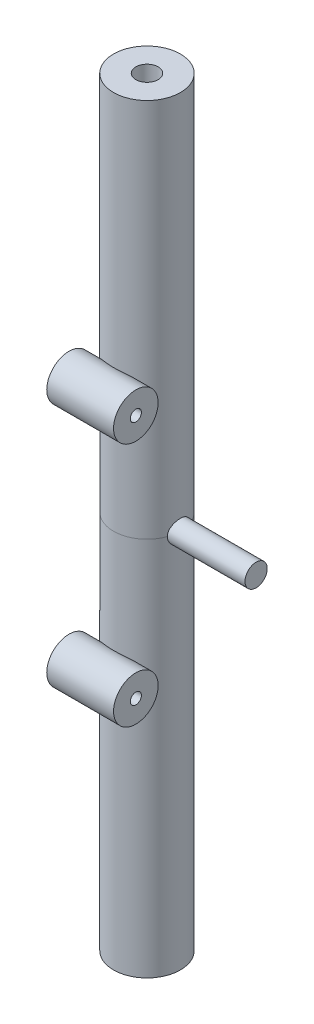
ISO-10303-21;
HEADER;
FILE_DESCRIPTION(('STEP AP214'),'2;1');
FILE_NAME('part.step','',(''),(''),'','','');
FILE_SCHEMA(('AUTOMOTIVE_DESIGN { 1 0 10303 214 1 1 1 1 }'));
ENDSEC;
DATA;
#1=APPLICATION_CONTEXT('core data for automotive mechanical design processes');
#2=APPLICATION_PROTOCOL_DEFINITION('international standard','automotive_design',2000,#1);
#3=PRODUCT_CONTEXT('',#1,'mechanical');
#4=PRODUCT('Part','Part','',(#3));
#5=PRODUCT_RELATED_PRODUCT_CATEGORY('part','',(#4));
#6=PRODUCT_DEFINITION_FORMATION('','',#4);
#7=PRODUCT_DEFINITION_CONTEXT('part definition',#1,'design');
#8=PRODUCT_DEFINITION('design','',#6,#7);
#9=PRODUCT_DEFINITION_SHAPE('','',#8);
#10=(LENGTH_UNIT() NAMED_UNIT(*) SI_UNIT(.MILLI.,.METRE.));
#11=(NAMED_UNIT(*) PLANE_ANGLE_UNIT() SI_UNIT($,.RADIAN.));
#12=(NAMED_UNIT(*) SI_UNIT($,.STERADIAN.) SOLID_ANGLE_UNIT());
#13=UNCERTAINTY_MEASURE_WITH_UNIT(LENGTH_MEASURE(1.E-05),#10,'distance_accuracy_value','');
#14=(GEOMETRIC_REPRESENTATION_CONTEXT(3) GLOBAL_UNCERTAINTY_ASSIGNED_CONTEXT((#13)) GLOBAL_UNIT_ASSIGNED_CONTEXT((#10,
#11,#12)) REPRESENTATION_CONTEXT('',''));
#15=CARTESIAN_POINT('',(0.,0.,0.));
#16=DIRECTION('',(0.,0.,1.));
#17=DIRECTION('',(1.,0.,0.));
#18=AXIS2_PLACEMENT_3D('',#15,#16,#17);
#19=CARTESIAN_POINT('',(108.,217.294070702894,0.));
#20=DIRECTION('',(-1.,0.,0.));
#21=DIRECTION('',(0.,0.,1.));
#22=AXIS2_PLACEMENT_3D('',#19,#20,#21);
#23=CYLINDRICAL_SURFACE('',#22,10.);
#24=CARTESIAN_POINT('',(108.,217.294070702894,0.));
#25=DIRECTION('',(1.,0.,0.));
#26=DIRECTION('',(0.,0.,-1.));
#27=AXIS2_PLACEMENT_3D('',#24,#25,#26);
#28=CIRCLE('',#27,10.);
#29=CARTESIAN_POINT('',(108.,217.294070702894,-10.));
#30=VERTEX_POINT('',#29);
#31=EDGE_CURVE('E11',#30,#30,#28,.T.);
#32=ORIENTED_EDGE('',*,*,#31,.F.);
#33=EDGE_LOOP('',(#32));
#34=FACE_BOUND('',#33,.T.);
#35=CARTESIAN_POINT('',(0.,217.294070702894,0.));
#36=DIRECTION('',(1.,0.,0.));
#37=DIRECTION('',(0.,0.,-1.));
#38=AXIS2_PLACEMENT_3D('',#35,#36,#37);
#39=CIRCLE('',#38,10.);
#40=CARTESIAN_POINT('',(0.,217.294070702894,-10.));
#41=VERTEX_POINT('',#40);
#42=EDGE_CURVE('E50',#41,#41,#39,.T.);
#43=ORIENTED_EDGE('',*,*,#42,.T.);
#44=EDGE_LOOP('',(#43));
#45=FACE_BOUND('',#44,.T.);
#46=ADVANCED_FACE('F47',(#34,#45),#23,.T.);
#47=CARTESIAN_POINT('',(108.,217.294070702894,0.));
#48=DIRECTION('',(1.,0.,0.));
#49=DIRECTION('',(0.,0.,-1.));
#50=AXIS2_PLACEMENT_3D('',#47,#48,#49);
#51=PLANE('',#50);
#52=ORIENTED_EDGE('',*,*,#31,.T.);
#53=EDGE_LOOP('',(#52));
#54=FACE_BOUND('',#53,.T.);
#55=ADVANCED_FACE('F62',(#54),#51,.T.);
#56=CARTESIAN_POINT('',(0.,217.294070702894,0.));
#57=DIRECTION('',(1.,0.,0.));
#58=DIRECTION('',(0.,0.,-1.));
#59=AXIS2_PLACEMENT_3D('',#56,#57,#58);
#60=PLANE('',#59);
#61=ORIENTED_EDGE('',*,*,#42,.F.);
#62=EDGE_LOOP('',(#61));
#63=FACE_BOUND('',#62,.T.);
#64=ADVANCED_FACE('F60',(#63),#60,.F.);
#65=CLOSED_SHELL('',(#46,#55,#64));
#66=MANIFOLD_SOLID_BREP('B2',#65);
#67=CARTESIAN_POINT('',(10.,0.,0.));
#68=DIRECTION('',(0.,-1.,0.));
#69=DIRECTION('',(0.,0.,-1.));
#70=AXIS2_PLACEMENT_3D('',#67,#68,#69);
#71=CYLINDRICAL_SURFACE('',#70,30.);
#72=CARTESIAN_POINT('',(10.,124.614578778583,30.));
#73=CARTESIAN_POINT('',(10.7003151489304,124.614585421696,29.999995243399));
#74=CARTESIAN_POINT('',(11.400800840522,124.600474669286,29.9754463005591));
#75=CARTESIAN_POINT('',(12.79745883686,124.543361448256,29.8774952813585));
#76=CARTESIAN_POINT('',(13.4936286560111,124.500343655376,29.8040672933309));
#77=CARTESIAN_POINT('',(14.8786361342423,124.383215007721,29.608937892571));
#78=CARTESIAN_POINT('',(15.5674471564154,124.309015653538,29.4870991346209));
#79=CARTESIAN_POINT('',(16.9304333798659,124.126207172882,29.1968252577275));
#80=CARTESIAN_POINT('',(17.604610792609,124.017603284937,29.0283972330878));
#81=CARTESIAN_POINT('',(18.9375462415734,123.760530256462,28.6461817070304));
#82=CARTESIAN_POINT('',(19.5961685824181,123.611795570023,28.4320941281652));
#83=CARTESIAN_POINT('',(20.5639949408617,123.354856604108,28.0806019988217));
#84=CARTESIAN_POINT('',(20.8833330734159,123.26354260318,27.9583420336882));
#85=CARTESIAN_POINT('',(21.5144673781411,123.068840204204,27.7043791984293));
#86=CARTESIAN_POINT('',(21.8262646188323,122.96545352906,27.5726776767509));
#87=CARTESIAN_POINT('',(22.4405572181016,122.746124692675,27.3010078083822));
#88=CARTESIAN_POINT('',(22.7430766724273,122.630219360544,27.1610642333722));
#89=CARTESIAN_POINT('',(23.3388099037913,122.38482880835,26.8735098153511));
#90=CARTESIAN_POINT('',(23.6320242353379,122.255344399472,26.7258994306058));
#91=CARTESIAN_POINT('',(24.2080337299261,121.982112026454,26.4241821549336));
#92=CARTESIAN_POINT('',(24.490835282315,121.838373015997,26.2700793766028));
#93=CARTESIAN_POINT('',(25.045290990134,121.535841152577,25.9565158105213));
#94=CARTESIAN_POINT('',(25.3169426218781,121.377044918175,25.7970538244546));
#95=CARTESIAN_POINT('',(25.9370084668131,120.987998431967,25.4201433208537));
#96=CARTESIAN_POINT('',(26.2806805617157,120.751622528133,25.201151699875));
#97=CARTESIAN_POINT('',(26.9439648687432,120.249988069905,24.7600626170207));
#98=CARTESIAN_POINT('',(27.2635835155065,119.984737286737,24.5379660047614));
#99=CARTESIAN_POINT('',(27.8766980608412,119.424888780115,24.0949509420086));
#100=CARTESIAN_POINT('',(28.170203055525,119.130301351807,23.8740321066693));
#101=CARTESIAN_POINT('',(28.7294200287342,118.511895121936,23.4378883390848));
#102=CARTESIAN_POINT('',(28.995130958597,118.188075218298,23.2226636219059));
#103=CARTESIAN_POINT('',(29.4986079029494,117.510461083016,22.8015916322614));
#104=CARTESIAN_POINT('',(29.7362248086438,117.15652268456,22.5957976614332));
#105=CARTESIAN_POINT('',(30.1809410067562,116.421875728086,22.1995131790536));
#106=CARTESIAN_POINT('',(30.3880399087849,116.041166827709,22.0090228632823));
#107=CARTESIAN_POINT('',(30.7711784537616,115.255473698412,21.6478064282427));
#108=CARTESIAN_POINT('',(30.9472167162493,114.850488391621,21.4770811875299));
#109=CARTESIAN_POINT('',(31.2680650227519,114.01938486962,21.1594053907149));
#110=CARTESIAN_POINT('',(31.4128773548335,113.593268205618,21.0124530928577));
#111=CARTESIAN_POINT('',(31.660096120451,112.7616125125,20.7573831641449));
#112=CARTESIAN_POINT('',(31.7651059643359,112.357540509824,20.6469913632628));
#113=CARTESIAN_POINT('',(31.9494965594403,111.537746726284,20.4508616973056));
#114=CARTESIAN_POINT('',(32.0288788769402,111.122025659065,20.3651223255804));
#115=CARTESIAN_POINT('',(32.1622771108467,110.282074715085,20.2198716064174));
#116=CARTESIAN_POINT('',(32.2162960057466,109.857845843521,20.1603571793658));
#117=CARTESIAN_POINT('',(32.2992123570006,109.00401367675,20.0686064564914));
#118=CARTESIAN_POINT('',(32.3281098550694,108.574410390469,20.0363701153725));
#119=CARTESIAN_POINT('',(32.3604826455532,107.724623784303,20.0002344037528));
#120=CARTESIAN_POINT('',(32.3646185607346,107.30449660349,19.9955986856563));
#121=CARTESIAN_POINT('',(32.3492500509971,106.465223429924,20.0127748600755));
#122=CARTESIAN_POINT('',(32.3297462039305,106.046077413439,20.0345861061195));
#123=CARTESIAN_POINT('',(32.2670108472954,105.211795510032,20.104288573118));
#124=CARTESIAN_POINT('',(32.2237819199816,104.796659191694,20.1521769558139));
#125=CARTESIAN_POINT('',(32.1134134233343,103.973305889422,20.2732248244314));
#126=CARTESIAN_POINT('',(32.0462737894001,103.565088924185,20.3463843786293));
#127=CARTESIAN_POINT('',(31.8879585297074,102.759048734262,20.5165967975756));
#128=CARTESIAN_POINT('',(31.7968174401842,102.361211470828,20.613615317955));
#129=CARTESIAN_POINT('',(31.5902199015646,101.57810296848,20.8299003475259));
#130=CARTESIAN_POINT('',(31.4747636511086,101.192831626939,20.949166674965));
#131=CARTESIAN_POINT('',(31.2193890719392,100.437518084348,21.2077938804435));
#132=CARTESIAN_POINT('',(31.0794745393663,100.067473530962,21.3471516395285));
#133=CARTESIAN_POINT('',(30.7751466827372,99.3449159788365,21.6434366603111));
#134=CARTESIAN_POINT('',(30.6107332498047,98.9924030580192,21.8003640000895));
#135=CARTESIAN_POINT('',(30.2560527645944,98.303973899725,22.1303291957354));
#136=CARTESIAN_POINT('',(30.0655733336081,97.9682286329588,22.3034952751334));
#137=CARTESIAN_POINT('',(29.6603245895251,97.3183536473615,22.6615248429052));
#138=CARTESIAN_POINT('',(29.4455552932197,97.0042239135881,22.8463883231926));
#139=CARTESIAN_POINT('',(28.9924522901329,96.3987789597058,23.2244220996617));
#140=CARTESIAN_POINT('',(28.7541171760095,96.1074651040168,23.4175928915634));
#141=CARTESIAN_POINT('',(28.2549151460428,95.5483798661283,23.8087930234118));
#142=CARTESIAN_POINT('',(27.9940474969702,95.2806092506198,24.0068225213151));
#143=CARTESIAN_POINT('',(27.4358872696772,94.75453233577,24.4154871128832));
#144=CARTESIAN_POINT('',(27.137374206015,94.4975890845771,24.6262087170248));
#145=CARTESIAN_POINT('',(26.5183841724003,94.00987679677,25.0456135565591));
#146=CARTESIAN_POINT('',(26.1979064754499,93.7791086271854,25.254296724221));
#147=CARTESIAN_POINT('',(25.5367646181133,93.3428664571443,25.6663341693088));
#148=CARTESIAN_POINT('',(25.1960932136627,93.1374016160633,25.869686496217));
#149=CARTESIAN_POINT('',(24.496633307887,92.7506800223235,26.2680348935946));
#150=CARTESIAN_POINT('',(24.1378438565429,92.5694245409014,26.4630305248878));
#151=CARTESIAN_POINT('',(23.3509615309241,92.205085726091,26.8695967365395));
#152=CARTESIAN_POINT('',(22.9203569792451,92.0255391434453,27.0794780750258));
#153=CARTESIAN_POINT('',(22.0408465416046,91.6939470228241,27.4818481442475));
#154=CARTESIAN_POINT('',(21.5919391643356,91.541903731316,27.6743354535975));
#155=CARTESIAN_POINT('',(20.6783209743475,91.2628461286236,28.0395363685617));
#156=CARTESIAN_POINT('',(20.2136023575016,91.1358443939438,28.2122400201695));
#157=CARTESIAN_POINT('',(19.2711050939451,90.9046570274022,28.5358540054607));
#158=CARTESIAN_POINT('',(18.793325723207,90.8004726633266,28.6867631280306));
#159=CARTESIAN_POINT('',(17.7291612723307,90.5938067291241,28.9935432807498));
#160=CARTESIAN_POINT('',(17.1403768114692,90.4959428751736,29.1442299968697));
#161=CARTESIAN_POINT('',(15.9510613222913,90.3270544548292,29.4101400161711));
#162=CARTESIAN_POINT('',(15.3505290078405,90.2560328445683,29.5253594130819));
#163=CARTESIAN_POINT('',(14.1408938463509,90.138396275763,29.7191584122811));
#164=CARTESIAN_POINT('',(13.5317865488545,90.0917945097483,29.7977182071528));
#165=CARTESIAN_POINT('',(12.3085986318353,90.0214034996118,29.9173544374422));
#166=CARTESIAN_POINT('',(11.6945177939687,89.9976152625624,29.9584292181308));
#167=CARTESIAN_POINT('',(10.3733703031887,89.9700735368126,30.0059944936165));
#168=CARTESIAN_POINT('',(9.66600400449622,89.9698097309828,30.0064608000143));
#169=CARTESIAN_POINT('',(8.25352764144889,89.9981716316443,29.9574587804282));
#170=CARTESIAN_POINT('',(7.54841782529085,90.0268004134886,29.9079851387912));
#171=CARTESIAN_POINT('',(6.14454118939011,90.1143805678,29.7596043406587));
#172=CARTESIAN_POINT('',(5.44578162934405,90.1733630581288,29.6606464571107));
#173=CARTESIAN_POINT('',(4.06044242546346,90.3244095483014,29.4145654884073));
#174=CARTESIAN_POINT('',(3.37386240582017,90.4164725255526,29.2674438921136));
#175=CARTESIAN_POINT('',(2.00378478112443,90.6401093201781,28.9235089726764));
#176=CARTESIAN_POINT('',(1.32065925779506,90.7724773504593,28.7257107970455));
#177=CARTESIAN_POINT('',(0.314636168789919,91.0042188251852,28.3957509386525));
#178=CARTESIAN_POINT('',(-0.0176756527132743,91.0870226905958,28.280187125649));
#179=CARTESIAN_POINT('',(-0.675227730096222,91.2645044132451,28.038581944899));
#180=CARTESIAN_POINT('',(-1.00046897392809,91.3591805989216,27.9125420529716));
#181=CARTESIAN_POINT('',(-1.64224297521796,91.5610007364375,27.6510035152622));
#182=CARTESIAN_POINT('',(-1.95879405836203,91.6681154817085,27.5155273146032));
#183=CARTESIAN_POINT('',(-2.5830028620475,91.8958256124215,27.235730240992));
#184=CARTESIAN_POINT('',(-2.8906611066659,92.016420201416,27.0914098908179));
#185=CARTESIAN_POINT('',(-3.49592643510591,92.2718568213576,26.7950262314914));
#186=CARTESIAN_POINT('',(-3.79353962495059,92.4066899836004,26.6429677723611));
#187=CARTESIAN_POINT('',(-4.37794587335996,92.6914881272087,26.3321906024948));
#188=CARTESIAN_POINT('',(-4.66473649059134,92.8414564950388,26.1734704058726));
#189=CARTESIAN_POINT('',(-5.31956381705338,93.2096267783456,25.7972250173315));
#190=CARTESIAN_POINT('',(-5.6830107733964,93.4339658149273,25.5776509738162));
#191=CARTESIAN_POINT('',(-6.38621726839363,93.9120968961289,25.132945678168));
#192=CARTESIAN_POINT('',(-6.72598325949006,94.1658808671595,24.9078159626272));
#193=CARTESIAN_POINT('',(-7.37947476119936,94.7037123822301,24.4563181151251));
#194=CARTESIAN_POINT('',(-7.69321337984418,94.9877445259021,24.229950668502));
#195=CARTESIAN_POINT('',(-8.29276435930515,95.5863852771778,23.7805628277982));
#196=CARTESIAN_POINT('',(-8.57857572095857,95.9009949779622,23.557542553712));
#197=CARTESIAN_POINT('',(-9.12212296474641,96.5621156202497,23.118546863222));
#198=CARTESIAN_POINT('',(-9.37968495405052,96.9088023005936,22.902620251634));
#199=CARTESIAN_POINT('',(-9.86350288706715,97.6310358127345,22.484296454603));
#200=CARTESIAN_POINT('',(-10.0897584019469,98.0065830397506,22.2818994545069));
#201=CARTESIAN_POINT('',(-10.5101535510754,98.7842282043643,21.8955512348094));
#202=CARTESIAN_POINT('',(-10.7042931526665,99.1863261689599,21.711600033965));
#203=CARTESIAN_POINT('',(-11.0601047024454,100.014030974111,21.3666435682391));
#204=CARTESIAN_POINT('',(-11.2217794773535,100.439635763804,21.205636305978));
#205=CARTESIAN_POINT('',(-11.498396169949,101.267893663882,20.9249583534813));
#206=CARTESIAN_POINT('',(-11.6163697073787,101.668690248715,20.802780057199));
#207=CARTESIAN_POINT('',(-11.8261574359812,102.483529050824,20.5825656028021));
#208=CARTESIAN_POINT('',(-11.9179734183744,102.897570358966,20.4845277916546));
#209=CARTESIAN_POINT('',(-12.0757076082756,103.735741030041,20.3144431478376));
#210=CARTESIAN_POINT('',(-12.1416290450489,104.159869128066,20.2423930743724));
#211=CARTESIAN_POINT('',(-12.2478526935195,105.015039364072,20.1255881854389));
#212=CARTESIAN_POINT('',(-12.2881550245965,105.446081469825,20.0808332427807));
#213=CARTESIAN_POINT('',(-12.3423997169162,106.297191206002,20.02045833694));
#214=CARTESIAN_POINT('',(-12.3571838454361,106.71713975165,20.0039082284238));
#215=CARTESIAN_POINT('',(-12.3630761322557,107.557402375784,19.9973210968004));
#216=CARTESIAN_POINT('',(-12.3541849904714,107.977716443096,20.0072832899057));
#217=CARTESIAN_POINT('',(-12.3126874535294,108.815669680143,20.0535517746873));
#218=CARTESIAN_POINT('',(-12.2800835720408,109.233309128666,20.0898552740525));
#219=CARTESIAN_POINT('',(-12.1910164173308,110.062978703423,20.188194154148));
#220=CARTESIAN_POINT('',(-12.134553053223,110.475008808284,20.2502296328974));
#221=CARTESIAN_POINT('',(-11.9977074325617,111.289559799568,20.398799685679));
#222=CARTESIAN_POINT('',(-11.9173818751242,111.6921008129,20.4852761618857));
#223=CARTESIAN_POINT('',(-11.732519899358,112.485843887034,20.6812888525295));
#224=CARTESIAN_POINT('',(-11.6279836902735,112.877046045801,20.7908248676705));
#225=CARTESIAN_POINT('',(-11.3945127033356,113.645362514678,21.0309972359943));
#226=CARTESIAN_POINT('',(-11.2655818498409,114.022479079065,21.1616301948244));
#227=CARTESIAN_POINT('',(-10.9832142231384,114.760207961051,21.4416470311767));
#228=CARTESIAN_POINT('',(-10.8297773820185,115.120820232909,21.5910309606622));
#229=CARTESIAN_POINT('',(-10.4974097311141,115.825609565973,21.9068265391255));
#230=CARTESIAN_POINT('',(-10.3183207711681,116.169665530327,22.0733418647095));
#231=CARTESIAN_POINT('',(-9.93572966520139,116.836957930894,22.4194825396991));
#232=CARTESIAN_POINT('',(-9.73222758188874,117.160194420581,22.5991078554297));
#233=CARTESIAN_POINT('',(-9.3014042354581,117.784437861564,22.9681565692082));
#234=CARTESIAN_POINT('',(-9.07408186631097,118.085443779536,23.1575804220171));
#235=CARTESIAN_POINT('',(-8.59651662405374,118.664278722324,23.5428051158312));
#236=CARTESIAN_POINT('',(-8.34627308636441,118.94210707468,23.7386061416307));
#237=CARTESIAN_POINT('',(-7.81150214547096,119.486904940183,24.1426587975807));
#238=CARTESIAN_POINT('',(-7.52590646865253,119.752715998089,24.3510574182378));
#239=CARTESIAN_POINT('',(-6.93240835497335,120.258473695868,24.7674171053191));
#240=CARTESIAN_POINT('',(-6.62450528469928,120.498419600823,24.975378159146));
#241=CARTESIAN_POINT('',(-5.9881042696087,120.953078830662,25.3874821454422));
#242=CARTESIAN_POINT('',(-5.65960170544125,121.167786464715,25.5916242080974));
#243=CARTESIAN_POINT('',(-4.98394845247285,121.572905030727,25.9929939810851));
#244=CARTESIAN_POINT('',(-4.63679683861592,121.763314755844,26.1902213476219));
#245=CARTESIAN_POINT('',(-3.87798944594823,122.145160721742,26.6009700609591));
#246=CARTESIAN_POINT('',(-3.4639324790635,122.33329993438,26.813121985549));
#247=CARTESIAN_POINT('',(-2.61703729953151,122.682125861497,27.2218945816919));
#248=CARTESIAN_POINT('',(-2.18419752684125,122.842810290173,27.4185139593184));
#249=CARTESIAN_POINT('',(-1.30195150093027,123.13913871646,27.7938107885529));
#250=CARTESIAN_POINT('',(-0.852529472333495,123.274758091222,27.9724705196267));
#251=CARTESIAN_POINT('',(0.0599973306491428,123.523000836759,28.3095924058039));
#252=CARTESIAN_POINT('',(0.523102510888181,123.635623524649,28.4680539610712));
#253=CARTESIAN_POINT('',(1.55530150275488,123.86058435163,28.792981484672));
#254=CARTESIAN_POINT('',(2.12693417030994,123.968284076135,28.9546162419133));
#255=CARTESIAN_POINT('',(3.28305661504276,124.156693898474,29.2444527470601));
#256=CARTESIAN_POINT('',(3.86754919417096,124.237398051118,29.3726471290807));
#257=CARTESIAN_POINT('',(5.04513223994441,124.374267119797,29.5940499762291));
#258=CARTESIAN_POINT('',(5.63821060681315,124.430463643435,29.6873034827633));
#259=CARTESIAN_POINT('',(6.83037152095021,124.520336311569,29.8381343142954));
#260=CARTESIAN_POINT('',(7.42945163541331,124.554021233829,29.8957255441477));
#261=CARTESIAN_POINT('',(8.35775590060479,124.589591503343,29.9568185181673));
#262=CARTESIAN_POINT('',(8.68592324497721,124.598971256942,29.9730070072648));
#263=CARTESIAN_POINT('',(9.34271455010528,124.61146322471,29.9945986732698));
#264=CARTESIAN_POINT('',(9.67133849427032,124.614575660936,30.0000022322974));
#265=CARTESIAN_POINT('',(10.,124.614578778583,30.));
#266=B_SPLINE_CURVE_WITH_KNOTS('',3,(#72,#73,#74,#75,#76,#77,#78,#79,#80,#81,#82,#83,#84,#85,
#86,#87,#88,#89,#90,#91,#92,#93,#94,#95,#96,#97,#98,#99,#100,#101,#102,#103,#104,#105,#106,#107,
#108,#109,#110,#111,#112,#113,#114,#115,#116,#117,#118,#119,#120,#121,#122,#123,#124,#125,#126,
#127,#128,#129,#130,#131,#132,#133,#134,#135,#136,#137,#138,#139,#140,#141,#142,#143,#144,#145,
#146,#147,#148,#149,#150,#151,#152,#153,#154,#155,#156,#157,#158,#159,#160,#161,#162,#163,#164,
#165,#166,#167,#168,#169,#170,#171,#172,#173,#174,#175,#176,#177,#178,#179,#180,#181,#182,#183,
#184,#185,#186,#187,#188,#189,#190,#191,#192,#193,#194,#195,#196,#197,#198,#199,#200,#201,#202,
#203,#204,#205,#206,#207,#208,#209,#210,#211,#212,#213,#214,#215,#216,#217,#218,#219,#220,#221,
#222,#223,#224,#225,#226,#227,#228,#229,#230,#231,#232,#233,#234,#235,#236,#237,#238,#239,#240,
#241,#242,#243,#244,#245,#246,#247,#248,#249,#250,#251,#252,#253,#254,#255,#256,#257,#258,#259,
#260,#261,#262,#263,#264,#265),.UNSPECIFIED.,.T.,.F.,(4,2,2,2,2,2,2,2,2,2,2,2,2,2,2,2,2,2,2,2,2,
2,2,2,2,2,2,2,2,2,2,2,2,2,2,2,2,2,2,2,2,2,2,2,2,2,2,2,2,2,2,2,2,2,2,2,2,2,2,2,2,2,2,2,2,2,2,2,2,
2,2,2,2,2,2,2,2,2,2,2,2,2,2,2,2,2,2,2,2,2,2,2,2,2,2,2,4),(0.,2.10066478408731,4.20244405638587,
6.31022931530273,8.41769379121729,10.539460700908,11.6008971205327,12.6621822462361,
13.7204260617528,14.7786066958259,15.8361268192179,16.8938849976523,18.3057053108689,
19.7171465895984,21.1280942832977,22.5390951924844,23.9572774108507,25.3754777691736,
26.7937411421763,28.2119005571958,29.5058368064409,30.7996939590658,32.0933991326203,
33.3871021579393,34.6461305285062,35.9051281239022,37.1639887162655,38.4228527097767,
39.6799151003015,40.9369672217629,42.1938244106284,43.4506871853015,44.7184790181064,
45.9862699745039,47.2541366886898,48.5220446759676,49.8607405247125,51.1994807038004,
52.5387040685405,53.8779977284644,55.4112484098015,56.9446242704812,58.4787682807541,
60.0129975100197,61.8579322842856,63.7030701818379,65.5492038681324,67.3954190457429,
69.5151115061985,71.6350296124195,73.7571253478375,75.8791554901244,78.0460511080251,
79.1300471985019,80.2138908388565,81.2952391299398,82.3765235640239,83.4571384328908,
84.5379956249527,85.9772241234704,87.4160589243589,88.8541646366508,90.2923217817024,
91.7388861997497,93.1854704307236,94.6320561326736,96.0785158253864,97.3827860681559,
98.6869669754579,99.9909851888636,101.294997325761,102.555107973689,103.815181369173,
105.07512121004,106.335065850352,107.59204035275,108.849003991971,110.105765595516,
111.362530681917,112.627407109976,113.892280289123,115.157212225206,116.422180848502,
117.747770651755,119.073398109589,120.399323904349,121.725315530356,123.229402808642,
124.733615251872,126.239297605624,127.745024664035,129.554430673914,131.364234904316,
133.171698068853,134.978456052301,135.964343784571,136.950196585308),.UNSPECIFIED.);
#267=CARTESIAN_POINT('',(10.,124.614578778583,30.));
#268=VERTEX_POINT('',#267);
#269=EDGE_CURVE('E111',#268,#268,#266,.T.);
#270=ORIENTED_EDGE('',*,*,#269,.T.);
#271=EDGE_LOOP('',(#270));
#272=FACE_BOUND('',#271,.T.);
#273=CARTESIAN_POINT('',(10.,-123.875929297106,0.));
#274=DIRECTION('',(0.,-1.,0.));
#275=DIRECTION('',(0.,0.,-1.));
#276=AXIS2_PLACEMENT_3D('',#273,#274,#275);
#277=CIRCLE('',#276,30.);
#278=CARTESIAN_POINT('',(10.,-123.875929297106,-30.));
#279=VERTEX_POINT('',#278);
#280=EDGE_CURVE('E155',#279,#279,#277,.T.);
#281=ORIENTED_EDGE('',*,*,#280,.F.);
#282=EDGE_LOOP('',(#281));
#283=FACE_BOUND('',#282,.T.);
#284=CARTESIAN_POINT('',(10.,217.294070702894,0.));
#285=DIRECTION('',(0.,1.,0.));
#286=DIRECTION('',(0.,0.,1.));
#287=AXIS2_PLACEMENT_3D('',#284,#285,#286);
#288=CIRCLE('',#287,30.);
#289=CARTESIAN_POINT('',(10.,217.294070702894,30.));
#290=VERTEX_POINT('',#289);
#291=EDGE_CURVE('E46',#290,#290,#288,.T.);
#292=ORIENTED_EDGE('',*,*,#291,.F.);
#293=EDGE_LOOP('',(#292));
#294=FACE_BOUND('',#293,.T.);
#295=ADVANCED_FACE('F87',(#272,#283,#294),#71,.T.);
#296=CARTESIAN_POINT('',(10.,0.,0.));
#297=DIRECTION('',(0.,-1.,0.));
#298=DIRECTION('',(0.,0.,-1.));
#299=AXIS2_PLACEMENT_3D('',#296,#297,#298);
#300=CYLINDRICAL_SURFACE('',#299,9.99999999999999);
#301=CARTESIAN_POINT('',(10.,558.464070702894,0.));
#302=DIRECTION('',(0.,-1.,0.));
#303=DIRECTION('',(0.,0.,-1.));
#304=AXIS2_PLACEMENT_3D('',#301,#302,#303);
#305=CIRCLE('',#304,10.);
#306=CARTESIAN_POINT('',(10.,558.464070702894,-10.));
#307=VERTEX_POINT('',#306);
#308=EDGE_CURVE('E101',#307,#307,#305,.T.);
#309=ORIENTED_EDGE('',*,*,#308,.F.);
#310=EDGE_LOOP('',(#309));
#311=FACE_BOUND('',#310,.T.);
#312=CARTESIAN_POINT('',(10.,-123.875929297106,0.));
#313=DIRECTION('',(0.,-1.,0.));
#314=DIRECTION('',(0.,0.,-1.));
#315=AXIS2_PLACEMENT_3D('',#312,#313,#314);
#316=CIRCLE('',#315,9.99999999999999);
#317=CARTESIAN_POINT('',(10.,-123.875929297106,-9.99999999999999));
#318=VERTEX_POINT('',#317);
#319=EDGE_CURVE('E118',#318,#318,#316,.T.);
#320=ORIENTED_EDGE('',*,*,#319,.T.);
#321=EDGE_LOOP('',(#320));
#322=FACE_BOUND('',#321,.T.);
#323=ADVANCED_FACE('F89',(#311,#322),#300,.F.);
#324=CARTESIAN_POINT('',(0.,558.464070702894,0.));
#325=DIRECTION('',(0.,-1.,0.));
#326=DIRECTION('',(0.,0.,-1.));
#327=AXIS2_PLACEMENT_3D('',#324,#325,#326);
#328=PLANE('',#327);
#329=CARTESIAN_POINT('',(10.,558.464070702894,0.));
#330=DIRECTION('',(0.,-1.,0.));
#331=DIRECTION('',(0.,0.,-1.));
#332=AXIS2_PLACEMENT_3D('',#329,#330,#331);
#333=CIRCLE('',#332,30.);
#334=CARTESIAN_POINT('',(10.,558.464070702894,-30.));
#335=VERTEX_POINT('',#334);
#336=EDGE_CURVE('E108',#335,#335,#333,.T.);
#337=ORIENTED_EDGE('',*,*,#336,.F.);
#338=EDGE_LOOP('',(#337));
#339=FACE_BOUND('',#338,.T.);
#340=ORIENTED_EDGE('',*,*,#308,.T.);
#341=EDGE_LOOP('',(#340));
#342=FACE_BOUND('',#341,.T.);
#343=ADVANCED_FACE('F140',(#339,#342),#328,.F.);
#344=CARTESIAN_POINT('',(10.,344.614578778583,30.));
#345=CARTESIAN_POINT('',(10.7003151489304,344.614585421696,29.999995243399));
#346=CARTESIAN_POINT('',(11.400800840522,344.600474669286,29.9754463005591));
#347=CARTESIAN_POINT('',(12.79745883686,344.543361448256,29.8774952813585));
#348=CARTESIAN_POINT('',(13.4936286560111,344.500343655376,29.8040672933309));
#349=CARTESIAN_POINT('',(14.8786361342423,344.383215007721,29.608937892571));
#350=CARTESIAN_POINT('',(15.5674471564154,344.309015653538,29.4870991346209));
#351=CARTESIAN_POINT('',(16.9304333798659,344.126207172882,29.1968252577275));
#352=CARTESIAN_POINT('',(17.604610792609,344.017603284937,29.0283972330878));
#353=CARTESIAN_POINT('',(18.9375462415734,343.760530256462,28.6461817070304));
#354=CARTESIAN_POINT('',(19.5961685824181,343.611795570023,28.4320941281652));
#355=CARTESIAN_POINT('',(20.5639949408617,343.354856604108,28.0806019988217));
#356=CARTESIAN_POINT('',(20.8833330734159,343.26354260318,27.9583420336882));
#357=CARTESIAN_POINT('',(21.5144673781411,343.068840204204,27.7043791984293));
#358=CARTESIAN_POINT('',(21.8262646188323,342.96545352906,27.5726776767509));
#359=CARTESIAN_POINT('',(22.4405572181016,342.746124692675,27.3010078083822));
#360=CARTESIAN_POINT('',(22.7430766724273,342.630219360544,27.1610642333722));
#361=CARTESIAN_POINT('',(23.3388099037913,342.38482880835,26.8735098153511));
#362=CARTESIAN_POINT('',(23.6320242353379,342.255344399472,26.7258994306058));
#363=CARTESIAN_POINT('',(24.2080337299261,341.982112026454,26.4241821549336));
#364=CARTESIAN_POINT('',(24.490835282315,341.838373015997,26.2700793766028));
#365=CARTESIAN_POINT('',(25.045290990134,341.535841152577,25.9565158105213));
#366=CARTESIAN_POINT('',(25.3169426218781,341.377044918175,25.7970538244546));
#367=CARTESIAN_POINT('',(25.9370084668131,340.987998431967,25.4201433208536));
#368=CARTESIAN_POINT('',(26.2806805617157,340.751622528133,25.201151699875));
#369=CARTESIAN_POINT('',(26.9439648687433,340.249988069905,24.7600626170207));
#370=CARTESIAN_POINT('',(27.2635835155066,339.984737286737,24.5379660047613));
#371=CARTESIAN_POINT('',(27.8766980608412,339.424888780115,24.0949509420086));
#372=CARTESIAN_POINT('',(28.170203055525,339.130301351807,23.8740321066693));
#373=CARTESIAN_POINT('',(28.7294200287342,338.511895121936,23.4378883390848));
#374=CARTESIAN_POINT('',(28.995130958597,338.188075218298,23.2226636219059));
#375=CARTESIAN_POINT('',(29.4986079029495,337.510461083016,22.8015916322614));
#376=CARTESIAN_POINT('',(29.7362248086438,337.15652268456,22.5957976614332));
#377=CARTESIAN_POINT('',(30.1809410067562,336.421875728086,22.1995131790536));
#378=CARTESIAN_POINT('',(30.3880399087849,336.041166827709,22.0090228632823));
#379=CARTESIAN_POINT('',(30.7711784537616,335.255473698412,21.6478064282427));
#380=CARTESIAN_POINT('',(30.9472167162493,334.850488391621,21.4770811875299));
#381=CARTESIAN_POINT('',(31.268065022752,334.01938486962,21.1594053907149));
#382=CARTESIAN_POINT('',(31.4128773548335,333.593268205618,21.0124530928577));
#383=CARTESIAN_POINT('',(31.660096120451,332.7616125125,20.7573831641449));
#384=CARTESIAN_POINT('',(31.7651059643359,332.357540509824,20.6469913632628));
#385=CARTESIAN_POINT('',(31.9494965594403,331.537746726284,20.4508616973056));
#386=CARTESIAN_POINT('',(32.0288788769402,331.122025659065,20.3651223255804));
#387=CARTESIAN_POINT('',(32.1622771108467,330.282074715085,20.2198716064174));
#388=CARTESIAN_POINT('',(32.2162960057466,329.857845843521,20.1603571793658));
#389=CARTESIAN_POINT('',(32.2992123570006,329.00401367675,20.0686064564914));
#390=CARTESIAN_POINT('',(32.3281098550694,328.574410390469,20.0363701153725));
#391=CARTESIAN_POINT('',(32.3604826455532,327.724623784303,20.0002344037528));
#392=CARTESIAN_POINT('',(32.3646185607346,327.30449660349,19.9955986856563));
#393=CARTESIAN_POINT('',(32.3492500509971,326.465223429924,20.0127748600755));
#394=CARTESIAN_POINT('',(32.3297462039305,326.046077413439,20.0345861061195));
#395=CARTESIAN_POINT('',(32.2670108472954,325.211795510032,20.104288573118));
#396=CARTESIAN_POINT('',(32.2237819199816,324.796659191694,20.1521769558139));
#397=CARTESIAN_POINT('',(32.1134134233343,323.973305889422,20.2732248244314));
#398=CARTESIAN_POINT('',(32.0462737894001,323.565088924185,20.3463843786293));
#399=CARTESIAN_POINT('',(31.8879585297074,322.759048734262,20.5165967975756));
#400=CARTESIAN_POINT('',(31.7968174401842,322.361211470828,20.613615317955));
#401=CARTESIAN_POINT('',(31.5902199015645,321.57810296848,20.8299003475259));
#402=CARTESIAN_POINT('',(31.4747636511086,321.192831626939,20.949166674965));
#403=CARTESIAN_POINT('',(31.2193890719392,320.437518084348,21.2077938804435));
#404=CARTESIAN_POINT('',(31.0794745393663,320.067473530962,21.3471516395285));
#405=CARTESIAN_POINT('',(30.7751466827372,319.344915978836,21.6434366603111));
#406=CARTESIAN_POINT('',(30.6107332498046,318.992403058019,21.8003640000895));
#407=CARTESIAN_POINT('',(30.2560527645944,318.303973899725,22.1303291957355));
#408=CARTESIAN_POINT('',(30.0655733336081,317.968228632959,22.3034952751335));
#409=CARTESIAN_POINT('',(29.660324589525,317.318353647361,22.6615248429052));
#410=CARTESIAN_POINT('',(29.4455552932197,317.004223913588,22.8463883231926));
#411=CARTESIAN_POINT('',(28.9924522901328,316.398778959706,23.2244220996618));
#412=CARTESIAN_POINT('',(28.7541171760095,316.107465104017,23.4175928915634));
#413=CARTESIAN_POINT('',(28.2549151460427,315.548379866128,23.8087930234118));
#414=CARTESIAN_POINT('',(27.9940474969701,315.28060925062,24.0068225213151));
#415=CARTESIAN_POINT('',(27.4358872696772,314.75453233577,24.4154871128832));
#416=CARTESIAN_POINT('',(27.1373742060149,314.497589084577,24.6262087170249));
#417=CARTESIAN_POINT('',(26.5183841724003,314.00987679677,25.0456135565591));
#418=CARTESIAN_POINT('',(26.1979064754499,313.779108627185,25.254296724221));
#419=CARTESIAN_POINT('',(25.5367646181133,313.342866457144,25.6663341693088));
#420=CARTESIAN_POINT('',(25.1960932136627,313.137401616063,25.869686496217));
#421=CARTESIAN_POINT('',(24.496633307887,312.750680022323,26.2680348935946));
#422=CARTESIAN_POINT('',(24.1378438565429,312.569424540901,26.4630305248879));
#423=CARTESIAN_POINT('',(23.3509615309241,312.205085726091,26.8695967365396));
#424=CARTESIAN_POINT('',(22.9203569792451,312.025539143445,27.0794780750258));
#425=CARTESIAN_POINT('',(22.0408465416045,311.693947022824,27.4818481442475));
#426=CARTESIAN_POINT('',(21.5919391643355,311.541903731316,27.6743354535975));
#427=CARTESIAN_POINT('',(20.6783209743475,311.262846128624,28.0395363685617));
#428=CARTESIAN_POINT('',(20.2136023575015,311.135844393944,28.2122400201696));
#429=CARTESIAN_POINT('',(19.271105093945,310.904657027402,28.5358540054607));
#430=CARTESIAN_POINT('',(18.7933257232069,310.800472663327,28.6867631280307));
#431=CARTESIAN_POINT('',(17.7291612723307,310.593806729124,28.9935432807498));
#432=CARTESIAN_POINT('',(17.1403768114691,310.495942875174,29.1442299968697));
#433=CARTESIAN_POINT('',(15.9510613222912,310.327054454829,29.4101400161711));
#434=CARTESIAN_POINT('',(15.3505290078404,310.256032844568,29.5253594130819));
#435=CARTESIAN_POINT('',(14.1408938463509,310.138396275763,29.7191584122811));
#436=CARTESIAN_POINT('',(13.5317865488545,310.091794509748,29.7977182071528));
#437=CARTESIAN_POINT('',(12.3085986318352,310.021403499612,29.9173544374422));
#438=CARTESIAN_POINT('',(11.6945177939687,309.997615262562,29.9584292181308));
#439=CARTESIAN_POINT('',(10.3733703031886,309.970073536813,30.0059944936165));
#440=CARTESIAN_POINT('',(9.66600400449615,309.969809730983,30.0064608000143));
#441=CARTESIAN_POINT('',(8.25352764144882,309.998171631644,29.9574587804282));
#442=CARTESIAN_POINT('',(7.54841782529078,310.026800413489,29.9079851387912));
#443=CARTESIAN_POINT('',(6.14454118939003,310.1143805678,29.7596043406587));
#444=CARTESIAN_POINT('',(5.44578162934397,310.173363058129,29.6606464571107));
#445=CARTESIAN_POINT('',(4.06044242546337,310.324409548302,29.4145654884073));
#446=CARTESIAN_POINT('',(3.37386240582009,310.416472525553,29.2674438921136));
#447=CARTESIAN_POINT('',(2.00378478112435,310.640109320178,28.9235089726764));
#448=CARTESIAN_POINT('',(1.32065925779498,310.772477350459,28.7257107970454));
#449=CARTESIAN_POINT('',(0.314636168789822,311.004218825185,28.3957509386525));
#450=CARTESIAN_POINT('',(-0.0176756527133749,311.087022690596,28.280187125649));
#451=CARTESIAN_POINT('',(-0.67522773009632,311.264504413245,28.038581944899));
#452=CARTESIAN_POINT('',(-1.00046897392818,311.359180598922,27.9125420529716));
#453=CARTESIAN_POINT('',(-1.64224297521804,311.561000736438,27.6510035152622));
#454=CARTESIAN_POINT('',(-1.95879405836211,311.668115481709,27.5155273146031));
#455=CARTESIAN_POINT('',(-2.58300286204758,311.895825612422,27.235730240992));
#456=CARTESIAN_POINT('',(-2.89066110666596,312.016420201416,27.0914098908179));
#457=CARTESIAN_POINT('',(-3.49592643510597,312.271856821358,26.7950262314914));
#458=CARTESIAN_POINT('',(-3.79353962495066,312.4066899836,26.6429677723611));
#459=CARTESIAN_POINT('',(-4.37794587336003,312.691488127209,26.3321906024947));
#460=CARTESIAN_POINT('',(-4.66473649059141,312.841456495039,26.1734704058726));
#461=CARTESIAN_POINT('',(-5.31956381705344,313.209626778346,25.7972250173315));
#462=CARTESIAN_POINT('',(-5.68301077339647,313.433965814927,25.5776509738161));
#463=CARTESIAN_POINT('',(-6.38621726839371,313.912096896129,25.132945678168));
#464=CARTESIAN_POINT('',(-6.72598325949015,314.16588086716,24.9078159626272));
#465=CARTESIAN_POINT('',(-7.37947476119944,314.70371238223,24.4563181151251));
#466=CARTESIAN_POINT('',(-7.69321337984426,314.987744525902,24.2299506685019));
#467=CARTESIAN_POINT('',(-8.29276435930521,315.586385277178,23.7805628277982));
#468=CARTESIAN_POINT('',(-8.57857572095863,315.900994977962,23.5575425537119));
#469=CARTESIAN_POINT('',(-9.12212296474645,316.56211562025,23.118546863222));
#470=CARTESIAN_POINT('',(-9.37968495405056,316.908802300594,22.902620251634));
#471=CARTESIAN_POINT('',(-9.86350288706718,317.631035812735,22.484296454603));
#472=CARTESIAN_POINT('',(-10.0897584019469,318.006583039751,22.2818994545069));
#473=CARTESIAN_POINT('',(-10.5101535510754,318.784228204364,21.8955512348094));
#474=CARTESIAN_POINT('',(-10.7042931526665,319.18632616896,21.711600033965));
#475=CARTESIAN_POINT('',(-11.0601047024454,320.014030974111,21.3666435682391));
#476=CARTESIAN_POINT('',(-11.2217794773535,320.439635763804,21.205636305978));
#477=CARTESIAN_POINT('',(-11.4983961699491,321.267893663882,20.9249583534813));
#478=CARTESIAN_POINT('',(-11.6163697073788,321.668690248715,20.802780057199));
#479=CARTESIAN_POINT('',(-11.8261574359812,322.483529050824,20.5825656028021));
#480=CARTESIAN_POINT('',(-11.9179734183745,322.897570358966,20.4845277916546));
#481=CARTESIAN_POINT('',(-12.0757076082756,323.735741030041,20.3144431478375));
#482=CARTESIAN_POINT('',(-12.141629045049,324.159869128066,20.2423930743724));
#483=CARTESIAN_POINT('',(-12.2478526935195,325.015039364072,20.1255881854389));
#484=CARTESIAN_POINT('',(-12.2881550245965,325.446081469825,20.0808332427807));
#485=CARTESIAN_POINT('',(-12.3423997169162,326.297191206002,20.02045833694));
#486=CARTESIAN_POINT('',(-12.3571838454361,326.71713975165,20.0039082284238));
#487=CARTESIAN_POINT('',(-12.3630761322557,327.557402375784,19.9973210968004));
#488=CARTESIAN_POINT('',(-12.3541849904714,327.977716443097,20.0072832899057));
#489=CARTESIAN_POINT('',(-12.3126874535294,328.815669680143,20.0535517746873));
#490=CARTESIAN_POINT('',(-12.2800835720408,329.233309128666,20.0898552740525));
#491=CARTESIAN_POINT('',(-12.1910164173307,330.062978703423,20.188194154148));
#492=CARTESIAN_POINT('',(-12.134553053223,330.475008808284,20.2502296328974));
#493=CARTESIAN_POINT('',(-11.9977074325617,331.289559799568,20.398799685679));
#494=CARTESIAN_POINT('',(-11.9173818751242,331.6921008129,20.4852761618857));
#495=CARTESIAN_POINT('',(-11.732519899358,332.485843887034,20.6812888525296));
#496=CARTESIAN_POINT('',(-11.6279836902735,332.877046045801,20.7908248676705));
#497=CARTESIAN_POINT('',(-11.3945127033356,333.645362514678,21.0309972359944));
#498=CARTESIAN_POINT('',(-11.2655818498408,334.022479079065,21.1616301948245));
#499=CARTESIAN_POINT('',(-10.9832142231383,334.760207961051,21.4416470311767));
#500=CARTESIAN_POINT('',(-10.8297773820185,335.12082023291,21.5910309606622));
#501=CARTESIAN_POINT('',(-10.4974097311141,335.825609565974,21.9068265391256));
#502=CARTESIAN_POINT('',(-10.318320771168,336.169665530327,22.0733418647096));
#503=CARTESIAN_POINT('',(-9.93572966520137,336.836957930894,22.4194825396991));
#504=CARTESIAN_POINT('',(-9.7322275818887,337.160194420581,22.5991078554297));
#505=CARTESIAN_POINT('',(-9.30140423545804,337.784437861564,22.9681565692082));
#506=CARTESIAN_POINT('',(-9.0740818663109,338.085443779536,23.1575804220172));
#507=CARTESIAN_POINT('',(-8.59651662405367,338.664278722324,23.5428051158312));
#508=CARTESIAN_POINT('',(-8.34627308636434,338.94210707468,23.7386061416308));
#509=CARTESIAN_POINT('',(-7.8115021454709,339.486904940183,24.1426587975807));
#510=CARTESIAN_POINT('',(-7.52590646865247,339.752715998089,24.3510574182378));
#511=CARTESIAN_POINT('',(-6.93240835497327,340.258473695868,24.7674171053191));
#512=CARTESIAN_POINT('',(-6.62450528469919,340.498419600824,24.975378159146));
#513=CARTESIAN_POINT('',(-5.98810426960859,340.953078830662,25.3874821454422));
#514=CARTESIAN_POINT('',(-5.65960170544115,341.167786464715,25.5916242080975));
#515=CARTESIAN_POINT('',(-4.98394845247275,341.572905030727,25.9929939810852));
#516=CARTESIAN_POINT('',(-4.63679683861582,341.763314755844,26.1902213476219));
#517=CARTESIAN_POINT('',(-3.87798944594813,342.145160721743,26.6009700609591));
#518=CARTESIAN_POINT('',(-3.4639324790634,342.33329993438,26.8131219855491));
#519=CARTESIAN_POINT('',(-2.61703729953141,342.682125861497,27.2218945816919));
#520=CARTESIAN_POINT('',(-2.18419752684115,342.842810290173,27.4185139593184));
#521=CARTESIAN_POINT('',(-1.30195150093016,343.13913871646,27.793810788553));
#522=CARTESIAN_POINT('',(-0.852529472333383,343.274758091222,27.9724705196267));
#523=CARTESIAN_POINT('',(0.059997330649256,343.523000836759,28.309592405804));
#524=CARTESIAN_POINT('',(0.523102510888293,343.635623524649,28.4680539610712));
#525=CARTESIAN_POINT('',(1.555301502755,343.86058435163,28.792981484672));
#526=CARTESIAN_POINT('',(2.12693417031007,343.968284076135,28.9546162419134));
#527=CARTESIAN_POINT('',(3.28305661504289,344.156693898474,29.2444527470602));
#528=CARTESIAN_POINT('',(3.8675491941711,344.237398051118,29.3726471290807));
#529=CARTESIAN_POINT('',(5.04513223994454,344.374267119797,29.5940499762291));
#530=CARTESIAN_POINT('',(5.63821060681328,344.430463643435,29.6873034827633));
#531=CARTESIAN_POINT('',(6.83037152095034,344.520336311569,29.8381343142954));
#532=CARTESIAN_POINT('',(7.42945163541344,344.554021233829,29.8957255441477));
#533=CARTESIAN_POINT('',(8.35775590060491,344.589591503343,29.9568185181674));
#534=CARTESIAN_POINT('',(8.6859232449773,344.598971256942,29.9730070072648));
#535=CARTESIAN_POINT('',(9.34271455010533,344.61146322471,29.9945986732698));
#536=CARTESIAN_POINT('',(9.67133849427035,344.614575660936,30.0000022322974));
#537=CARTESIAN_POINT('',(10.,344.614578778583,30.));
#538=B_SPLINE_CURVE_WITH_KNOTS('',3,(#344,#345,#346,#347,#348,#349,#350,#351,#352,#353,#354,
#355,#356,#357,#358,#359,#360,#361,#362,#363,#364,#365,#366,#367,#368,#369,#370,#371,#372,#373,
#374,#375,#376,#377,#378,#379,#380,#381,#382,#383,#384,#385,#386,#387,#388,#389,#390,#391,#392,
#393,#394,#395,#396,#397,#398,#399,#400,#401,#402,#403,#404,#405,#406,#407,#408,#409,#410,#411,
#412,#413,#414,#415,#416,#417,#418,#419,#420,#421,#422,#423,#424,#425,#426,#427,#428,#429,#430,
#431,#432,#433,#434,#435,#436,#437,#438,#439,#440,#441,#442,#443,#444,#445,#446,#447,#448,#449,
#450,#451,#452,#453,#454,#455,#456,#457,#458,#459,#460,#461,#462,#463,#464,#465,#466,#467,#468,
#469,#470,#471,#472,#473,#474,#475,#476,#477,#478,#479,#480,#481,#482,#483,#484,#485,#486,#487,
#488,#489,#490,#491,#492,#493,#494,#495,#496,#497,#498,#499,#500,#501,#502,#503,#504,#505,#506,
#507,#508,#509,#510,#511,#512,#513,#514,#515,#516,#517,#518,#519,#520,#521,#522,#523,#524,#525,
#526,#527,#528,#529,#530,#531,#532,#533,#534,#535,#536,#537),.UNSPECIFIED.,.T.,.F.,(4,2,2,2,2,2,
2,2,2,2,2,2,2,2,2,2,2,2,2,2,2,2,2,2,2,2,2,2,2,2,2,2,2,2,2,2,2,2,2,2,2,2,2,2,2,2,2,2,2,2,2,2,2,2,
2,2,2,2,2,2,2,2,2,2,2,2,2,2,2,2,2,2,2,2,2,2,2,2,2,2,2,2,2,2,2,2,2,2,2,2,2,2,2,2,2,2,4),(0.,
2.10066478408731,4.20244405638586,6.31022931530272,8.41769379121729,10.5394607009079,
11.6008971205327,12.6621822462361,13.7204260617528,14.7786066958259,15.8361268192179,
16.8938849976523,18.3057053108689,19.7171465895984,21.1280942832977,22.5390951924844,
23.9572774108508,25.3754777691737,26.7937411421763,28.2119005571958,29.505836806441,
30.7996939590658,32.0933991326203,33.3871021579394,34.6461305285062,35.9051281239022,
37.1639887162655,38.4228527097768,39.6799151003016,40.936967221763,42.1938244106285,
43.4506871853016,44.7184790181065,45.9862699745039,47.2541366886899,48.5220446759676,
49.8607405247126,51.1994807038005,52.5387040685406,53.8779977284644,55.4112484098016,
56.9446242704813,58.4787682807542,60.0129975100198,61.8579322842857,63.703070181838,
65.5492038681325,67.395419045743,69.5151115061986,71.6350296124196,73.7571253478375,
75.8791554901244,78.0460511080252,79.1300471985019,80.2138908388566,81.2952391299399,
82.376523564024,83.4571384328908,84.5379956249528,85.9772241234705,87.416058924359,
88.8541646366508,90.2923217817024,91.7388861997498,93.1854704307237,94.6320561326737,
96.0785158253865,97.3827860681559,98.6869669754579,99.9909851888637,101.294997325761,
102.555107973689,103.815181369173,105.07512121004,106.335065850352,107.59204035275,
108.849003991971,110.105765595516,111.362530681917,112.627407109976,113.892280289123,
115.157212225206,116.422180848502,117.747770651755,119.073398109589,120.399323904349,
121.725315530356,123.229402808642,124.733615251872,126.239297605624,127.745024664035,
129.554430673915,131.364234904317,133.171698068853,134.978456052301,135.964343784571,
136.950196585308),.UNSPECIFIED.);
#539=CARTESIAN_POINT('',(10.,344.614578778583,30.));
#540=VERTEX_POINT('',#539);
#541=EDGE_CURVE('E91',#540,#540,#538,.T.);
#542=ORIENTED_EDGE('',*,*,#541,.T.);
#543=EDGE_LOOP('',(#542));
#544=FACE_BOUND('',#543,.T.);
#545=ORIENTED_EDGE('',*,*,#291,.T.);
#546=EDGE_LOOP('',(#545));
#547=FACE_BOUND('',#546,.T.);
#548=ORIENTED_EDGE('',*,*,#336,.T.);
#549=EDGE_LOOP('',(#548));
#550=FACE_BOUND('',#549,.T.);
#551=ADVANCED_FACE('F120',(#544,#547,#550),#71,.T.);
#552=CARTESIAN_POINT('',(0.,-123.875929297106,0.));
#553=DIRECTION('',(0.,1.,0.));
#554=DIRECTION('',(0.,0.,1.));
#555=AXIS2_PLACEMENT_3D('',#552,#553,#554);
#556=PLANE('',#555);
#557=ORIENTED_EDGE('',*,*,#319,.F.);
#558=EDGE_LOOP('',(#557));
#559=FACE_BOUND('',#558,.T.);
#560=ORIENTED_EDGE('',*,*,#280,.T.);
#561=EDGE_LOOP('',(#560));
#562=FACE_BOUND('',#561,.T.);
#563=ADVANCED_FACE('F129',(#559,#562),#556,.F.);
#564=CARTESIAN_POINT('',(0.,107.294070702894,40.));
#565=DIRECTION('',(-1.,0.,0.));
#566=DIRECTION('',(0.,0.,1.));
#567=AXIS2_PLACEMENT_3D('',#564,#565,#566);
#568=CYLINDRICAL_SURFACE('',#567,20.);
#569=CARTESIAN_POINT('',(40.,107.294070702894,40.));
#570=DIRECTION('',(-1.,0.,0.));
#571=DIRECTION('',(0.,0.,1.));
#572=AXIS2_PLACEMENT_3D('',#569,#570,#571);
#573=CIRCLE('',#572,20.);
#574=CARTESIAN_POINT('',(40.,107.294070702894,60.));
#575=VERTEX_POINT('',#574);
#576=EDGE_CURVE('E167',#575,#575,#573,.T.);
#577=ORIENTED_EDGE('',*,*,#576,.T.);
#578=EDGE_LOOP('',(#577));
#579=FACE_BOUND('',#578,.T.);
#580=CARTESIAN_POINT('',(-20.,107.294070702894,40.));
#581=DIRECTION('',(-1.,0.,0.));
#582=DIRECTION('',(0.,0.,1.));
#583=AXIS2_PLACEMENT_3D('',#580,#581,#582);
#584=CIRCLE('',#583,20.);
#585=CARTESIAN_POINT('',(-20.,107.294070702894,60.));
#586=VERTEX_POINT('',#585);
#587=EDGE_CURVE('E119',#586,#586,#584,.T.);
#588=ORIENTED_EDGE('',*,*,#587,.F.);
#589=EDGE_LOOP('',(#588));
#590=FACE_BOUND('',#589,.T.);
#591=ORIENTED_EDGE('',*,*,#269,.F.);
#592=EDGE_LOOP('',(#591));
#593=FACE_BOUND('',#592,.T.);
#594=ADVANCED_FACE('F123',(#579,#590,#593),#568,.T.);
#595=CARTESIAN_POINT('',(-20.,102.294070702894,40.));
#596=DIRECTION('',(-1.,0.,0.));
#597=DIRECTION('',(0.,0.,1.));
#598=AXIS2_PLACEMENT_3D('',#595,#596,#597);
#599=PLANE('',#598);
#600=ORIENTED_EDGE('',*,*,#587,.T.);
#601=EDGE_LOOP('',(#600));
#602=FACE_BOUND('',#601,.T.);
#603=CARTESIAN_POINT('',(-20.,107.294070702894,40.));
#604=DIRECTION('',(-1.,0.,0.));
#605=DIRECTION('',(0.,0.,1.));
#606=AXIS2_PLACEMENT_3D('',#603,#604,#605);
#607=CIRCLE('',#606,5.);
#608=CARTESIAN_POINT('',(-20.,107.294070702894,45.));
#609=VERTEX_POINT('',#608);
#610=EDGE_CURVE('E175',#609,#609,#607,.T.);
#611=ORIENTED_EDGE('',*,*,#610,.F.);
#612=EDGE_LOOP('',(#611));
#613=FACE_BOUND('',#612,.T.);
#614=ADVANCED_FACE('F128',(#602,#613),#599,.T.);
#615=CARTESIAN_POINT('',(40.,102.294070702894,40.));
#616=DIRECTION('',(1.,0.,0.));
#617=DIRECTION('',(0.,0.,-1.));
#618=AXIS2_PLACEMENT_3D('',#615,#616,#617);
#619=PLANE('',#618);
#620=CARTESIAN_POINT('',(40.,107.294070702894,40.));
#621=DIRECTION('',(-1.,0.,0.));
#622=DIRECTION('',(0.,0.,1.));
#623=AXIS2_PLACEMENT_3D('',#620,#621,#622);
#624=CIRCLE('',#623,5.);
#625=CARTESIAN_POINT('',(40.,107.294070702894,45.));
#626=VERTEX_POINT('',#625);
#627=EDGE_CURVE('E171',#626,#626,#624,.T.);
#628=ORIENTED_EDGE('',*,*,#627,.T.);
#629=EDGE_LOOP('',(#628));
#630=FACE_BOUND('',#629,.T.);
#631=ORIENTED_EDGE('',*,*,#576,.F.);
#632=EDGE_LOOP('',(#631));
#633=FACE_BOUND('',#632,.T.);
#634=ADVANCED_FACE('F131',(#630,#633),#619,.T.);
#635=CARTESIAN_POINT('',(0.,107.294070702894,40.));
#636=DIRECTION('',(-1.,0.,0.));
#637=DIRECTION('',(0.,0.,1.));
#638=AXIS2_PLACEMENT_3D('',#635,#636,#637);
#639=CYLINDRICAL_SURFACE('',#638,5.);
#640=ORIENTED_EDGE('',*,*,#610,.T.);
#641=EDGE_LOOP('',(#640));
#642=FACE_BOUND('',#641,.T.);
#643=ORIENTED_EDGE('',*,*,#627,.F.);
#644=EDGE_LOOP('',(#643));
#645=FACE_BOUND('',#644,.T.);
#646=ADVANCED_FACE('F213',(#642,#645),#639,.F.);
#647=CARTESIAN_POINT('',(0.,327.294070702894,40.));
#648=DIRECTION('',(-1.,0.,0.));
#649=DIRECTION('',(0.,0.,1.));
#650=AXIS2_PLACEMENT_3D('',#647,#648,#649);
#651=CYLINDRICAL_SURFACE('',#650,20.);
#652=CARTESIAN_POINT('',(40.,327.294070702894,40.));
#653=DIRECTION('',(1.,0.,0.));
#654=DIRECTION('',(0.,0.,1.));
#655=AXIS2_PLACEMENT_3D('',#652,#653,#654);
#656=CIRCLE('',#655,20.);
#657=CARTESIAN_POINT('',(40.,327.294070702894,60.));
#658=VERTEX_POINT('',#657);
#659=EDGE_CURVE('E183',#658,#658,#656,.T.);
#660=ORIENTED_EDGE('',*,*,#659,.F.);
#661=EDGE_LOOP('',(#660));
#662=FACE_BOUND('',#661,.T.);
#663=CARTESIAN_POINT('',(-20.,327.294070702894,40.));
#664=DIRECTION('',(1.,0.,0.));
#665=DIRECTION('',(0.,0.,1.));
#666=AXIS2_PLACEMENT_3D('',#663,#664,#665);
#667=CIRCLE('',#666,20.);
#668=CARTESIAN_POINT('',(-20.,327.294070702894,60.));
#669=VERTEX_POINT('',#668);
#670=EDGE_CURVE('E179',#669,#669,#667,.T.);
#671=ORIENTED_EDGE('',*,*,#670,.T.);
#672=EDGE_LOOP('',(#671));
#673=FACE_BOUND('',#672,.T.);
#674=ORIENTED_EDGE('',*,*,#541,.F.);
#675=EDGE_LOOP('',(#674));
#676=FACE_BOUND('',#675,.T.);
#677=ADVANCED_FACE('F210',(#662,#673,#676),#651,.T.);
#678=CARTESIAN_POINT('',(-20.,332.294070702894,40.));
#679=DIRECTION('',(-1.,0.,0.));
#680=DIRECTION('',(0.,0.,1.));
#681=AXIS2_PLACEMENT_3D('',#678,#679,#680);
#682=PLANE('',#681);
#683=ORIENTED_EDGE('',*,*,#670,.F.);
#684=EDGE_LOOP('',(#683));
#685=FACE_BOUND('',#684,.T.);
#686=CARTESIAN_POINT('',(-20.,327.294070702894,40.));
#687=DIRECTION('',(1.,0.,0.));
#688=DIRECTION('',(0.,0.,1.));
#689=AXIS2_PLACEMENT_3D('',#686,#687,#688);
#690=CIRCLE('',#689,5.);
#691=CARTESIAN_POINT('',(-20.,327.294070702894,45.));
#692=VERTEX_POINT('',#691);
#693=EDGE_CURVE('E191',#692,#692,#690,.T.);
#694=ORIENTED_EDGE('',*,*,#693,.T.);
#695=EDGE_LOOP('',(#694));
#696=FACE_BOUND('',#695,.T.);
#697=ADVANCED_FACE('F196',(#685,#696),#682,.T.);
#698=CARTESIAN_POINT('',(40.,332.294070702894,40.));
#699=DIRECTION('',(1.,0.,0.));
#700=DIRECTION('',(0.,0.,-1.));
#701=AXIS2_PLACEMENT_3D('',#698,#699,#700);
#702=PLANE('',#701);
#703=CARTESIAN_POINT('',(40.,327.294070702894,40.));
#704=DIRECTION('',(1.,0.,0.));
#705=DIRECTION('',(0.,0.,1.));
#706=AXIS2_PLACEMENT_3D('',#703,#704,#705);
#707=CIRCLE('',#706,5.);
#708=CARTESIAN_POINT('',(40.,327.294070702894,45.));
#709=VERTEX_POINT('',#708);
#710=EDGE_CURVE('E187',#709,#709,#707,.T.);
#711=ORIENTED_EDGE('',*,*,#710,.F.);
#712=EDGE_LOOP('',(#711));
#713=FACE_BOUND('',#712,.T.);
#714=ORIENTED_EDGE('',*,*,#659,.T.);
#715=EDGE_LOOP('',(#714));
#716=FACE_BOUND('',#715,.T.);
#717=ADVANCED_FACE('F201',(#713,#716),#702,.T.);
#718=CARTESIAN_POINT('',(0.,327.294070702894,40.));
#719=DIRECTION('',(-1.,0.,0.));
#720=DIRECTION('',(0.,0.,1.));
#721=AXIS2_PLACEMENT_3D('',#718,#719,#720);
#722=CYLINDRICAL_SURFACE('',#721,5.);
#723=ORIENTED_EDGE('',*,*,#693,.F.);
#724=EDGE_LOOP('',(#723));
#725=FACE_BOUND('',#724,.T.);
#726=ORIENTED_EDGE('',*,*,#710,.T.);
#727=EDGE_LOOP('',(#726));
#728=FACE_BOUND('',#727,.T.);
#729=ADVANCED_FACE('F198',(#725,#728),#722,.F.);
#730=CLOSED_SHELL('',(#295,#323,#343,#551,#563,#594,#614,#634,#646,#677,#697,#717,#729));
#731=MANIFOLD_SOLID_BREP('B6',#730);
#732=ADVANCED_BREP_SHAPE_REPRESENTATION('',(#18,#66,#731),#14);
#733=SHAPE_DEFINITION_REPRESENTATION(#9,#732);
ENDSEC;
END-ISO-10303-21;
